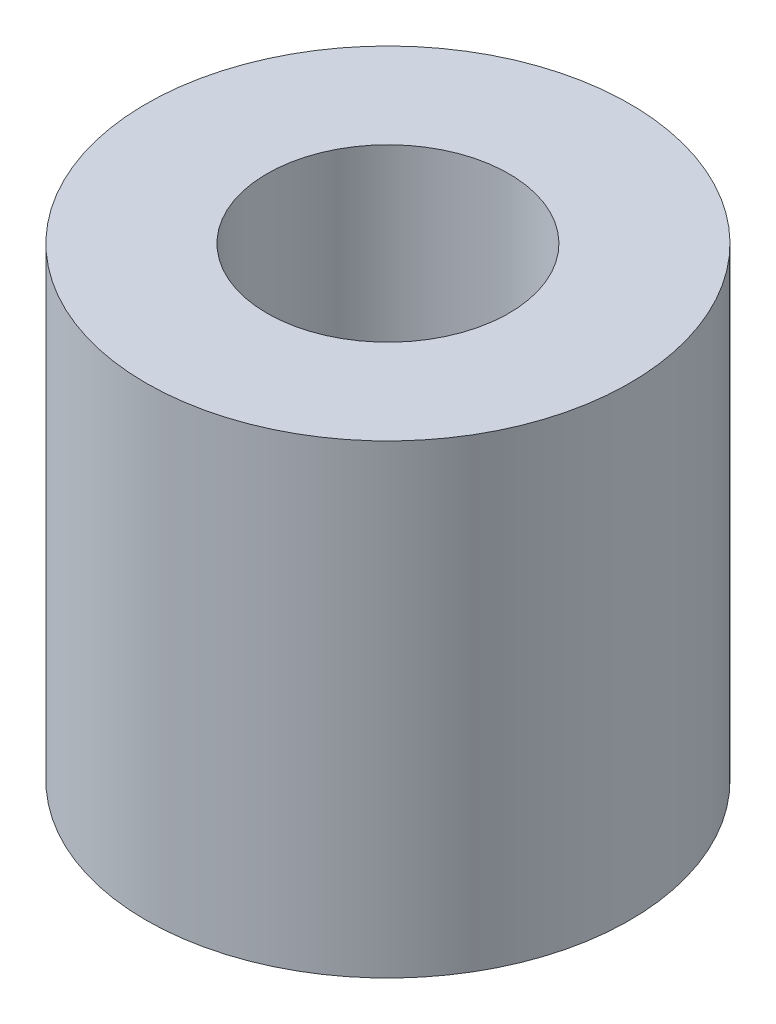
ISO-10303-21;
HEADER;
FILE_DESCRIPTION(('STEP AP214'),'2;1');
FILE_NAME('part.step','',(''),(''),'','','');
FILE_SCHEMA(('AUTOMOTIVE_DESIGN { 1 0 10303 214 1 1 1 1 }'));
ENDSEC;
DATA;
#1=APPLICATION_CONTEXT('core data for automotive mechanical design processes');
#2=APPLICATION_PROTOCOL_DEFINITION('international standard','automotive_design',2000,#1);
#3=PRODUCT_CONTEXT('',#1,'mechanical');
#4=PRODUCT('Part','Part','',(#3));
#5=PRODUCT_RELATED_PRODUCT_CATEGORY('part','',(#4));
#6=PRODUCT_DEFINITION_FORMATION('','',#4);
#7=PRODUCT_DEFINITION_CONTEXT('part definition',#1,'design');
#8=PRODUCT_DEFINITION('design','',#6,#7);
#9=PRODUCT_DEFINITION_SHAPE('','',#8);
#10=(LENGTH_UNIT() NAMED_UNIT(*) SI_UNIT(.MILLI.,.METRE.));
#11=(NAMED_UNIT(*) PLANE_ANGLE_UNIT() SI_UNIT($,.RADIAN.));
#12=(NAMED_UNIT(*) SI_UNIT($,.STERADIAN.) SOLID_ANGLE_UNIT());
#13=UNCERTAINTY_MEASURE_WITH_UNIT(LENGTH_MEASURE(1.E-05),#10,'distance_accuracy_value','');
#14=(GEOMETRIC_REPRESENTATION_CONTEXT(3) GLOBAL_UNCERTAINTY_ASSIGNED_CONTEXT((#13)) GLOBAL_UNIT_ASSIGNED_CONTEXT((#10,
#11,#12)) REPRESENTATION_CONTEXT('',''));
#15=CARTESIAN_POINT('',(0.,0.,0.));
#16=DIRECTION('',(0.,0.,1.));
#17=DIRECTION('',(1.,0.,0.));
#18=AXIS2_PLACEMENT_3D('',#15,#16,#17);
#19=CARTESIAN_POINT('',(0.,12.7,0.));
#20=DIRECTION('',(0.,1.,0.));
#21=DIRECTION('',(0.,0.,1.));
#22=AXIS2_PLACEMENT_3D('',#19,#20,#21);
#23=PLANE('',#22);
#24=CARTESIAN_POINT('',(0.,12.7,0.));
#25=DIRECTION('',(0.,1.,0.));
#26=DIRECTION('',(0.,0.,1.));
#27=AXIS2_PLACEMENT_3D('',#24,#25,#26);
#28=CIRCLE('',#27,6.604);
#29=CARTESIAN_POINT('',(0.,12.7,6.604));
#30=VERTEX_POINT('',#29);
#31=EDGE_CURVE('E10',#30,#30,#28,.T.);
#32=ORIENTED_EDGE('',*,*,#31,.T.);
#33=EDGE_LOOP('',(#32));
#34=FACE_BOUND('',#33,.T.);
#35=CARTESIAN_POINT('',(0.,12.7,0.));
#36=DIRECTION('',(0.,1.,0.));
#37=DIRECTION('',(0.,0.,1.));
#38=AXIS2_PLACEMENT_3D('',#35,#36,#37);
#39=CIRCLE('',#38,3.302);
#40=CARTESIAN_POINT('',(0.,12.7,3.302));
#41=VERTEX_POINT('',#40);
#42=EDGE_CURVE('E43',#41,#41,#39,.T.);
#43=ORIENTED_EDGE('',*,*,#42,.F.);
#44=EDGE_LOOP('',(#43));
#45=FACE_BOUND('',#44,.T.);
#46=ADVANCED_FACE('F32',(#34,#45),#23,.T.);
#47=CARTESIAN_POINT('',(0.,0.,0.));
#48=DIRECTION('',(0.,1.,0.));
#49=DIRECTION('',(0.,0.,1.));
#50=AXIS2_PLACEMENT_3D('',#47,#48,#49);
#51=PLANE('',#50);
#52=CARTESIAN_POINT('',(0.,0.,0.));
#53=DIRECTION('',(0.,1.,0.));
#54=DIRECTION('',(0.,0.,1.));
#55=AXIS2_PLACEMENT_3D('',#52,#53,#54);
#56=CIRCLE('',#55,6.604);
#57=CARTESIAN_POINT('',(0.,0.,6.604));
#58=VERTEX_POINT('',#57);
#59=EDGE_CURVE('E36',#58,#58,#56,.T.);
#60=ORIENTED_EDGE('',*,*,#59,.F.);
#61=EDGE_LOOP('',(#60));
#62=FACE_BOUND('',#61,.T.);
#63=CARTESIAN_POINT('',(0.,0.,0.));
#64=DIRECTION('',(0.,1.,0.));
#65=DIRECTION('',(0.,0.,1.));
#66=AXIS2_PLACEMENT_3D('',#63,#64,#65);
#67=CIRCLE('',#66,3.302);
#68=CARTESIAN_POINT('',(0.,0.,3.302));
#69=VERTEX_POINT('',#68);
#70=EDGE_CURVE('E45',#69,#69,#67,.T.);
#71=ORIENTED_EDGE('',*,*,#70,.T.);
#72=EDGE_LOOP('',(#71));
#73=FACE_BOUND('',#72,.T.);
#74=ADVANCED_FACE('F55',(#62,#73),#51,.F.);
#75=CARTESIAN_POINT('',(0.,12.7,0.));
#76=DIRECTION('',(0.,-1.,0.));
#77=DIRECTION('',(0.,0.,-1.));
#78=AXIS2_PLACEMENT_3D('',#75,#76,#77);
#79=CYLINDRICAL_SURFACE('',#78,6.604);
#80=ORIENTED_EDGE('',*,*,#31,.F.);
#81=EDGE_LOOP('',(#80));
#82=FACE_BOUND('',#81,.T.);
#83=ORIENTED_EDGE('',*,*,#59,.T.);
#84=EDGE_LOOP('',(#83));
#85=FACE_BOUND('',#84,.T.);
#86=ADVANCED_FACE('F34',(#82,#85),#79,.T.);
#87=CARTESIAN_POINT('',(0.,12.7,0.));
#88=DIRECTION('',(0.,-1.,0.));
#89=DIRECTION('',(0.,0.,-1.));
#90=AXIS2_PLACEMENT_3D('',#87,#88,#89);
#91=CYLINDRICAL_SURFACE('',#90,3.302);
#92=ORIENTED_EDGE('',*,*,#42,.T.);
#93=EDGE_LOOP('',(#92));
#94=FACE_BOUND('',#93,.T.);
#95=ORIENTED_EDGE('',*,*,#70,.F.);
#96=EDGE_LOOP('',(#95));
#97=FACE_BOUND('',#96,.T.);
#98=ADVANCED_FACE('F51',(#94,#97),#91,.F.);
#99=CLOSED_SHELL('',(#46,#74,#86,#98));
#100=MANIFOLD_SOLID_BREP('B2',#99);
#101=ADVANCED_BREP_SHAPE_REPRESENTATION('',(#18,#100),#14);
#102=SHAPE_DEFINITION_REPRESENTATION(#9,#101);
ENDSEC;
END-ISO-10303-21;
